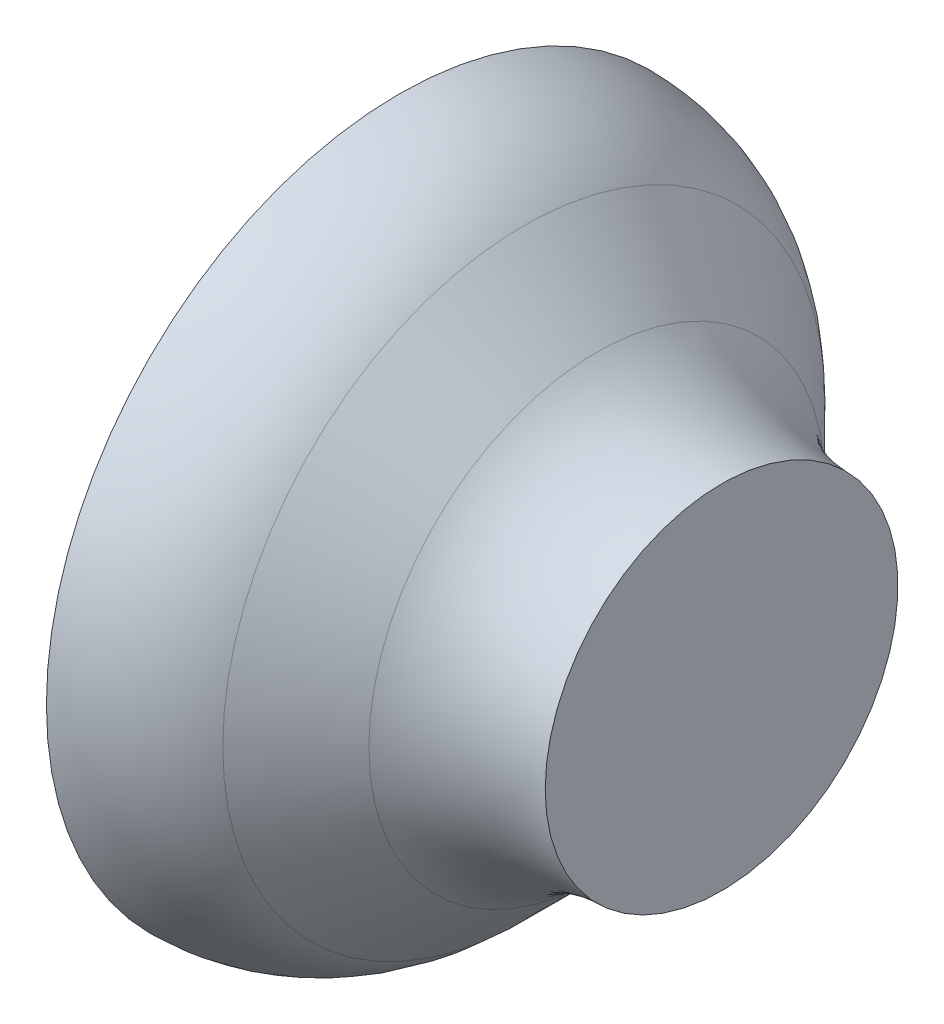
ISO-10303-21;
HEADER;
FILE_DESCRIPTION(('STEP AP214'),'2;1');
FILE_NAME('part.step','',(''),(''),'','','');
FILE_SCHEMA(('AUTOMOTIVE_DESIGN { 1 0 10303 214 1 1 1 1 }'));
ENDSEC;
DATA;
#1=APPLICATION_CONTEXT('core data for automotive mechanical design processes');
#2=APPLICATION_PROTOCOL_DEFINITION('international standard','automotive_design',2000,#1);
#3=PRODUCT_CONTEXT('',#1,'mechanical');
#4=PRODUCT('Part','Part','',(#3));
#5=PRODUCT_RELATED_PRODUCT_CATEGORY('part','',(#4));
#6=PRODUCT_DEFINITION_FORMATION('','',#4);
#7=PRODUCT_DEFINITION_CONTEXT('part definition',#1,'design');
#8=PRODUCT_DEFINITION('design','',#6,#7);
#9=PRODUCT_DEFINITION_SHAPE('','',#8);
#10=(LENGTH_UNIT() NAMED_UNIT(*) SI_UNIT(.MILLI.,.METRE.));
#11=(NAMED_UNIT(*) PLANE_ANGLE_UNIT() SI_UNIT($,.RADIAN.));
#12=(NAMED_UNIT(*) SI_UNIT($,.STERADIAN.) SOLID_ANGLE_UNIT());
#13=UNCERTAINTY_MEASURE_WITH_UNIT(LENGTH_MEASURE(1.E-05),#10,'distance_accuracy_value','');
#14=(GEOMETRIC_REPRESENTATION_CONTEXT(3) GLOBAL_UNCERTAINTY_ASSIGNED_CONTEXT((#13)) GLOBAL_UNIT_ASSIGNED_CONTEXT((#10,
#11,#12)) REPRESENTATION_CONTEXT('',''));
#15=CARTESIAN_POINT('',(0.,0.,0.));
#16=DIRECTION('',(0.,0.,1.));
#17=DIRECTION('',(1.,0.,0.));
#18=AXIS2_PLACEMENT_3D('',#15,#16,#17);
#19=CARTESIAN_POINT('',(0.,35.7821992,0.));
#20=DIRECTION('',(1.,0.,0.));
#21=DIRECTION('',(0.,0.,-1.));
#22=AXIS2_PLACEMENT_3D('',#19,#20,#21);
#23=PLANE('',#22);
#24=CARTESIAN_POINT('',(0.,0.,0.));
#25=DIRECTION('',(-1.,0.,0.));
#26=DIRECTION('',(0.,0.,1.));
#27=AXIS2_PLACEMENT_3D('',#24,#25,#26);
#28=CIRCLE('',#27,35.7821992);
#29=CARTESIAN_POINT('',(0.,0.,35.7821992));
#30=VERTEX_POINT('',#29);
#31=EDGE_CURVE('E10',#30,#30,#28,.T.);
#32=ORIENTED_EDGE('',*,*,#31,.T.);
#33=EDGE_LOOP('',(#32));
#34=FACE_BOUND('',#33,.T.);
#35=ADVANCED_FACE('F37',(#34),#23,.F.);
#36=CARTESIAN_POINT('',(0.,0.,0.));
#37=DIRECTION('',(-1.,0.,0.));
#38=DIRECTION('',(0.,0.,1.));
#39=AXIS2_PLACEMENT_3D('',#36,#37,#38);
#40=TOROIDAL_SURFACE('',#39,17.8910996,17.8910996);
#41=ORIENTED_EDGE('',*,*,#31,.F.);
#42=EDGE_LOOP('',(#41));
#43=FACE_BOUND('',#42,.T.);
#44=CARTESIAN_POINT('',(12.6509178500439,0.,0.));
#45=DIRECTION('',(-1.,0.,0.));
#46=DIRECTION('',(0.,0.,1.));
#47=AXIS2_PLACEMENT_3D('',#44,#45,#46);
#48=CIRCLE('',#47,30.542017450044);
#49=CARTESIAN_POINT('',(12.6509178500439,0.,30.542017450044));
#50=VERTEX_POINT('',#49);
#51=EDGE_CURVE('E44',#50,#50,#48,.T.);
#52=ORIENTED_EDGE('',*,*,#51,.T.);
#53=EDGE_LOOP('',(#52));
#54=FACE_BOUND('',#53,.T.);
#55=ADVANCED_FACE('F73',(#43,#54),#40,.T.);
#56=CARTESIAN_POINT('',(20.0616539501319,0.,0.));
#57=DIRECTION('',(-1.,0.,0.));
#58=DIRECTION('',(0.,0.,1.));
#59=AXIS2_PLACEMENT_3D('',#56,#57,#58);
#60=CONICAL_SURFACE('',#59,23.131281349956,0.785398163397442);
#61=ORIENTED_EDGE('',*,*,#51,.F.);
#62=EDGE_LOOP('',(#61));
#63=FACE_BOUND('',#62,.T.);
#64=CARTESIAN_POINT('',(20.0616539501319,0.,0.));
#65=DIRECTION('',(-1.,0.,0.));
#66=DIRECTION('',(0.,0.,1.));
#67=AXIS2_PLACEMENT_3D('',#64,#65,#66);
#68=CIRCLE('',#67,23.131281349956);
#69=CARTESIAN_POINT('',(20.0616539501319,0.,23.131281349956));
#70=VERTEX_POINT('',#69);
#71=EDGE_CURVE('E49',#70,#70,#68,.T.);
#72=ORIENTED_EDGE('',*,*,#71,.T.);
#73=EDGE_LOOP('',(#72));
#74=FACE_BOUND('',#73,.T.);
#75=ADVANCED_FACE('F69',(#63,#74),#60,.T.);
#76=CARTESIAN_POINT('',(32.7125718001758,0.,0.));
#77=DIRECTION('',(-1.,0.,0.));
#78=DIRECTION('',(0.,0.,1.));
#79=AXIS2_PLACEMENT_3D('',#76,#77,#78);
#80=TOROIDAL_SURFACE('',#79,35.7821992,17.8910996);
#81=ORIENTED_EDGE('',*,*,#71,.F.);
#82=EDGE_LOOP('',(#81));
#83=FACE_BOUND('',#82,.T.);
#84=CARTESIAN_POINT('',(32.7125718001758,0.,0.));
#85=DIRECTION('',(-1.,0.,0.));
#86=DIRECTION('',(0.,0.,1.));
#87=AXIS2_PLACEMENT_3D('',#84,#85,#86);
#88=CIRCLE('',#87,17.8910996);
#89=CARTESIAN_POINT('',(32.7125718001758,0.,17.8910996));
#90=VERTEX_POINT('',#89);
#91=EDGE_CURVE('E54',#90,#90,#88,.T.);
#92=ORIENTED_EDGE('',*,*,#91,.T.);
#93=EDGE_LOOP('',(#92));
#94=FACE_BOUND('',#93,.T.);
#95=ADVANCED_FACE('F61',(#83,#94),#80,.F.);
#96=CARTESIAN_POINT('',(32.7125718001758,0.,0.));
#97=DIRECTION('',(-1.,0.,0.));
#98=DIRECTION('',(0.,0.,1.));
#99=AXIS2_PLACEMENT_3D('',#96,#97,#98);
#100=PLANE('',#99);
#101=ORIENTED_EDGE('',*,*,#91,.F.);
#102=EDGE_LOOP('',(#101));
#103=FACE_BOUND('',#102,.T.);
#104=ADVANCED_FACE('F63',(#103),#100,.F.);
#105=CLOSED_SHELL('',(#35,#55,#75,#95,#104));
#106=MANIFOLD_SOLID_BREP('B2',#105);
#107=ADVANCED_BREP_SHAPE_REPRESENTATION('',(#18,#106),#14);
#108=SHAPE_DEFINITION_REPRESENTATION(#9,#107);
ENDSEC;
END-ISO-10303-21;
